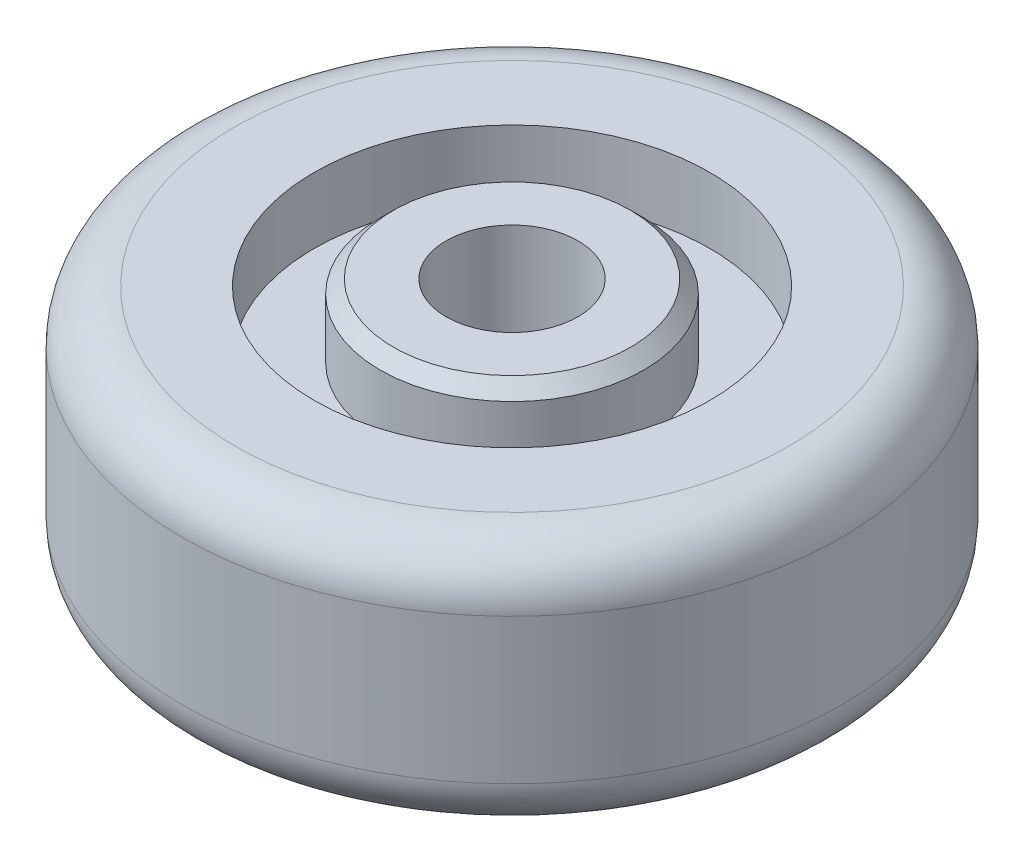
ISO-10303-21;
HEADER;
FILE_DESCRIPTION(('STEP AP214'),'2;1');
FILE_NAME('part.step','',(''),(''),'','','');
FILE_SCHEMA(('AUTOMOTIVE_DESIGN { 1 0 10303 214 1 1 1 1 }'));
ENDSEC;
DATA;
#1=APPLICATION_CONTEXT('core data for automotive mechanical design processes');
#2=APPLICATION_PROTOCOL_DEFINITION('international standard','automotive_design',2000,#1);
#3=PRODUCT_CONTEXT('',#1,'mechanical');
#4=PRODUCT('Part','Part','',(#3));
#5=PRODUCT_RELATED_PRODUCT_CATEGORY('part','',(#4));
#6=PRODUCT_DEFINITION_FORMATION('','',#4);
#7=PRODUCT_DEFINITION_CONTEXT('part definition',#1,'design');
#8=PRODUCT_DEFINITION('design','',#6,#7);
#9=PRODUCT_DEFINITION_SHAPE('','',#8);
#10=(LENGTH_UNIT() NAMED_UNIT(*) SI_UNIT(.MILLI.,.METRE.));
#11=(NAMED_UNIT(*) PLANE_ANGLE_UNIT() SI_UNIT($,.RADIAN.));
#12=(NAMED_UNIT(*) SI_UNIT($,.STERADIAN.) SOLID_ANGLE_UNIT());
#13=UNCERTAINTY_MEASURE_WITH_UNIT(LENGTH_MEASURE(1.E-05),#10,'distance_accuracy_value','');
#14=(GEOMETRIC_REPRESENTATION_CONTEXT(3) GLOBAL_UNCERTAINTY_ASSIGNED_CONTEXT((#13)) GLOBAL_UNIT_ASSIGNED_CONTEXT((#10,
#11,#12)) REPRESENTATION_CONTEXT('',''));
#15=CARTESIAN_POINT('',(0.,0.,0.));
#16=DIRECTION('',(0.,0.,1.));
#17=DIRECTION('',(1.,0.,0.));
#18=AXIS2_PLACEMENT_3D('',#15,#16,#17);
#19=CARTESIAN_POINT('',(0.,10.,-5.));
#20=DIRECTION('',(0.,-1.,0.));
#21=DIRECTION('',(0.,0.,-1.));
#22=AXIS2_PLACEMENT_3D('',#19,#20,#21);
#23=PLANE('',#22);
#24=CARTESIAN_POINT('',(0.,10.,0.));
#25=DIRECTION('',(0.,-1.,0.));
#26=DIRECTION('',(0.,0.,-1.));
#27=AXIS2_PLACEMENT_3D('',#24,#25,#26);
#28=CIRCLE('',#27,9.00000000000001);
#29=CARTESIAN_POINT('',(0.,10.,-9.00000000000001));
#30=VERTEX_POINT('',#29);
#31=EDGE_CURVE('E64',#30,#30,#28,.F.);
#32=ORIENTED_EDGE('',*,*,#31,.T.);
#33=EDGE_LOOP('',(#32));
#34=FACE_BOUND('',#33,.T.);
#35=CARTESIAN_POINT('',(0.,10.,0.));
#36=DIRECTION('',(0.,1.,0.));
#37=DIRECTION('',(0.,0.,1.));
#38=AXIS2_PLACEMENT_3D('',#35,#36,#37);
#39=CIRCLE('',#38,5.);
#40=CARTESIAN_POINT('',(0.,10.,5.));
#41=VERTEX_POINT('',#40);
#42=EDGE_CURVE('E118',#41,#41,#39,.T.);
#43=ORIENTED_EDGE('',*,*,#42,.F.);
#44=EDGE_LOOP('',(#43));
#45=FACE_BOUND('',#44,.T.);
#46=ADVANCED_FACE('F45',(#34,#45),#23,.F.);
#47=CARTESIAN_POINT('',(0.,38.551811756492,0.));
#48=DIRECTION('',(0.,1.,0.));
#49=DIRECTION('',(0.,0.,1.));
#50=AXIS2_PLACEMENT_3D('',#47,#48,#49);
#51=CYLINDRICAL_SURFACE('',#50,10.);
#52=CARTESIAN_POINT('',(0.,8.99999999999999,0.));
#53=DIRECTION('',(0.,-1.,0.));
#54=DIRECTION('',(0.,0.,-1.));
#55=AXIS2_PLACEMENT_3D('',#52,#53,#54);
#56=CIRCLE('',#55,10.);
#57=CARTESIAN_POINT('',(0.,8.99999999999999,-10.));
#58=VERTEX_POINT('',#57);
#59=EDGE_CURVE('E59',#58,#58,#56,.T.);
#60=ORIENTED_EDGE('',*,*,#59,.T.);
#61=EDGE_LOOP('',(#60));
#62=FACE_BOUND('',#61,.T.);
#63=CARTESIAN_POINT('',(0.,4.5,0.));
#64=DIRECTION('',(0.,1.,0.));
#65=DIRECTION('',(0.,0.,1.));
#66=AXIS2_PLACEMENT_3D('',#63,#64,#65);
#67=CIRCLE('',#66,10.);
#68=CARTESIAN_POINT('',(0.,4.5,10.));
#69=VERTEX_POINT('',#68);
#70=EDGE_CURVE('E94',#69,#69,#67,.T.);
#71=ORIENTED_EDGE('',*,*,#70,.T.);
#72=EDGE_LOOP('',(#71));
#73=FACE_BOUND('',#72,.T.);
#74=ADVANCED_FACE('F126',(#62,#73),#51,.T.);
#75=CARTESIAN_POINT('',(0.,4.5,-10.));
#76=DIRECTION('',(0.,-1.,0.));
#77=DIRECTION('',(0.,0.,-1.));
#78=AXIS2_PLACEMENT_3D('',#75,#76,#77);
#79=PLANE('',#78);
#80=ORIENTED_EDGE('',*,*,#70,.F.);
#81=EDGE_LOOP('',(#80));
#82=FACE_BOUND('',#81,.T.);
#83=CARTESIAN_POINT('',(0.,4.5,0.));
#84=DIRECTION('',(0.,1.,0.));
#85=DIRECTION('',(0.,0.,1.));
#86=AXIS2_PLACEMENT_3D('',#83,#84,#85);
#87=CIRCLE('',#86,15.);
#88=CARTESIAN_POINT('',(0.,4.5,15.));
#89=VERTEX_POINT('',#88);
#90=EDGE_CURVE('E98',#89,#89,#87,.T.);
#91=ORIENTED_EDGE('',*,*,#90,.T.);
#92=EDGE_LOOP('',(#91));
#93=FACE_BOUND('',#92,.T.);
#94=ADVANCED_FACE('F133',(#82,#93),#79,.F.);
#95=CARTESIAN_POINT('',(0.,38.551811756492,0.));
#96=DIRECTION('',(0.,1.,0.));
#97=DIRECTION('',(0.,0.,1.));
#98=AXIS2_PLACEMENT_3D('',#95,#96,#97);
#99=CYLINDRICAL_SURFACE('',#98,15.);
#100=ORIENTED_EDGE('',*,*,#90,.F.);
#101=EDGE_LOOP('',(#100));
#102=FACE_BOUND('',#101,.T.);
#103=CARTESIAN_POINT('',(0.,9.5,0.));
#104=DIRECTION('',(0.,1.,0.));
#105=DIRECTION('',(0.,0.,1.));
#106=AXIS2_PLACEMENT_3D('',#103,#104,#105);
#107=CIRCLE('',#106,15.);
#108=CARTESIAN_POINT('',(0.,9.5,15.));
#109=VERTEX_POINT('',#108);
#110=EDGE_CURVE('E102',#109,#109,#107,.T.);
#111=ORIENTED_EDGE('',*,*,#110,.T.);
#112=EDGE_LOOP('',(#111));
#113=FACE_BOUND('',#112,.T.);
#114=ADVANCED_FACE('F167',(#102,#113),#99,.F.);
#115=CARTESIAN_POINT('',(0.,9.5,-15.));
#116=DIRECTION('',(0.,-1.,0.));
#117=DIRECTION('',(0.,0.,-1.));
#118=AXIS2_PLACEMENT_3D('',#115,#116,#117);
#119=PLANE('',#118);
#120=CARTESIAN_POINT('',(0.,9.5,0.));
#121=DIRECTION('',(0.,-1.,0.));
#122=DIRECTION('',(0.,0.,-1.));
#123=AXIS2_PLACEMENT_3D('',#120,#121,#122);
#124=CIRCLE('',#123,21.);
#125=CARTESIAN_POINT('',(0.,9.5,-21.));
#126=VERTEX_POINT('',#125);
#127=EDGE_CURVE('E90',#126,#126,#124,.F.);
#128=ORIENTED_EDGE('',*,*,#127,.T.);
#129=EDGE_LOOP('',(#128));
#130=FACE_BOUND('',#129,.T.);
#131=ORIENTED_EDGE('',*,*,#110,.F.);
#132=EDGE_LOOP('',(#131));
#133=FACE_BOUND('',#132,.T.);
#134=ADVANCED_FACE('F172',(#130,#133),#119,.F.);
#135=CARTESIAN_POINT('',(0.,38.551811756492,0.));
#136=DIRECTION('',(0.,1.,0.));
#137=DIRECTION('',(0.,0.,1.));
#138=AXIS2_PLACEMENT_3D('',#135,#136,#137);
#139=CYLINDRICAL_SURFACE('',#138,25.);
#140=CARTESIAN_POINT('',(0.,5.5,0.));
#141=DIRECTION('',(0.,-1.,0.));
#142=DIRECTION('',(0.,0.,-1.));
#143=AXIS2_PLACEMENT_3D('',#140,#141,#142);
#144=CIRCLE('',#143,25.);
#145=CARTESIAN_POINT('',(0.,5.5,-25.));
#146=VERTEX_POINT('',#145);
#147=EDGE_CURVE('E82',#146,#146,#144,.T.);
#148=ORIENTED_EDGE('',*,*,#147,.T.);
#149=EDGE_LOOP('',(#148));
#150=FACE_BOUND('',#149,.T.);
#151=CARTESIAN_POINT('',(0.,-5.5,0.));
#152=DIRECTION('',(0.,1.,0.));
#153=DIRECTION('',(0.,0.,1.));
#154=AXIS2_PLACEMENT_3D('',#151,#152,#153);
#155=CIRCLE('',#154,25.);
#156=CARTESIAN_POINT('',(0.,-5.5,25.));
#157=VERTEX_POINT('',#156);
#158=EDGE_CURVE('E86',#157,#157,#155,.T.);
#159=ORIENTED_EDGE('',*,*,#158,.T.);
#160=EDGE_LOOP('',(#159));
#161=FACE_BOUND('',#160,.T.);
#162=ADVANCED_FACE('F177',(#150,#161),#139,.T.);
#163=CARTESIAN_POINT('',(0.,-9.5,-25.));
#164=DIRECTION('',(0.,1.,0.));
#165=DIRECTION('',(0.,0.,1.));
#166=AXIS2_PLACEMENT_3D('',#163,#164,#165);
#167=PLANE('',#166);
#168=CARTESIAN_POINT('',(0.,-9.5,0.));
#169=DIRECTION('',(0.,1.,0.));
#170=DIRECTION('',(0.,0.,1.));
#171=AXIS2_PLACEMENT_3D('',#168,#169,#170);
#172=CIRCLE('',#171,21.);
#173=CARTESIAN_POINT('',(0.,-9.5,21.));
#174=VERTEX_POINT('',#173);
#175=EDGE_CURVE('E74',#174,#174,#172,.F.);
#176=ORIENTED_EDGE('',*,*,#175,.T.);
#177=EDGE_LOOP('',(#176));
#178=FACE_BOUND('',#177,.T.);
#179=CARTESIAN_POINT('',(0.,-9.5,0.));
#180=DIRECTION('',(0.,1.,0.));
#181=DIRECTION('',(0.,0.,1.));
#182=AXIS2_PLACEMENT_3D('',#179,#180,#181);
#183=CIRCLE('',#182,19.);
#184=CARTESIAN_POINT('',(0.,-9.5,19.));
#185=VERTEX_POINT('',#184);
#186=EDGE_CURVE('E78',#185,#185,#183,.T.);
#187=ORIENTED_EDGE('',*,*,#186,.T.);
#188=EDGE_LOOP('',(#187));
#189=FACE_BOUND('',#188,.T.);
#190=ADVANCED_FACE('F184',(#178,#189),#167,.F.);
#191=CARTESIAN_POINT('',(0.,38.551811756492,0.));
#192=DIRECTION('',(0.,1.,0.));
#193=DIRECTION('',(0.,0.,1.));
#194=AXIS2_PLACEMENT_3D('',#191,#192,#193);
#195=CYLINDRICAL_SURFACE('',#194,15.);
#196=CARTESIAN_POINT('',(0.,-5.5,0.));
#197=DIRECTION('',(0.,1.,0.));
#198=DIRECTION('',(0.,0.,1.));
#199=AXIS2_PLACEMENT_3D('',#196,#197,#198);
#200=CIRCLE('',#199,15.);
#201=CARTESIAN_POINT('',(0.,-5.5,15.));
#202=VERTEX_POINT('',#201);
#203=EDGE_CURVE('E70',#202,#202,#200,.F.);
#204=ORIENTED_EDGE('',*,*,#203,.T.);
#205=EDGE_LOOP('',(#204));
#206=FACE_BOUND('',#205,.T.);
#207=CARTESIAN_POINT('',(0.,-4.5,0.));
#208=DIRECTION('',(0.,1.,0.));
#209=DIRECTION('',(0.,0.,1.));
#210=AXIS2_PLACEMENT_3D('',#207,#208,#209);
#211=CIRCLE('',#210,15.);
#212=CARTESIAN_POINT('',(0.,-4.5,15.));
#213=VERTEX_POINT('',#212);
#214=EDGE_CURVE('E106',#213,#213,#211,.T.);
#215=ORIENTED_EDGE('',*,*,#214,.T.);
#216=EDGE_LOOP('',(#215));
#217=FACE_BOUND('',#216,.T.);
#218=ADVANCED_FACE('F190',(#206,#217),#195,.F.);
#219=CARTESIAN_POINT('',(0.,-4.5,-15.));
#220=DIRECTION('',(0.,1.,0.));
#221=DIRECTION('',(0.,0.,1.));
#222=AXIS2_PLACEMENT_3D('',#219,#220,#221);
#223=PLANE('',#222);
#224=ORIENTED_EDGE('',*,*,#214,.F.);
#225=EDGE_LOOP('',(#224));
#226=FACE_BOUND('',#225,.T.);
#227=CARTESIAN_POINT('',(0.,-4.5,0.));
#228=DIRECTION('',(0.,1.,0.));
#229=DIRECTION('',(0.,0.,1.));
#230=AXIS2_PLACEMENT_3D('',#227,#228,#229);
#231=CIRCLE('',#230,10.);
#232=CARTESIAN_POINT('',(0.,-4.5,10.));
#233=VERTEX_POINT('',#232);
#234=EDGE_CURVE('E110',#233,#233,#231,.T.);
#235=ORIENTED_EDGE('',*,*,#234,.T.);
#236=EDGE_LOOP('',(#235));
#237=FACE_BOUND('',#236,.T.);
#238=ADVANCED_FACE('F194',(#226,#237),#223,.F.);
#239=CARTESIAN_POINT('',(0.,38.551811756492,0.));
#240=DIRECTION('',(0.,1.,0.));
#241=DIRECTION('',(0.,0.,1.));
#242=AXIS2_PLACEMENT_3D('',#239,#240,#241);
#243=CYLINDRICAL_SURFACE('',#242,10.);
#244=CARTESIAN_POINT('',(0.,-8.99999999999999,0.));
#245=DIRECTION('',(0.,1.,0.));
#246=DIRECTION('',(0.,0.,1.));
#247=AXIS2_PLACEMENT_3D('',#244,#245,#246);
#248=CIRCLE('',#247,10.);
#249=CARTESIAN_POINT('',(0.,-8.99999999999999,10.));
#250=VERTEX_POINT('',#249);
#251=EDGE_CURVE('E54',#250,#250,#248,.T.);
#252=ORIENTED_EDGE('',*,*,#251,.T.);
#253=EDGE_LOOP('',(#252));
#254=FACE_BOUND('',#253,.T.);
#255=ORIENTED_EDGE('',*,*,#234,.F.);
#256=EDGE_LOOP('',(#255));
#257=FACE_BOUND('',#256,.T.);
#258=ADVANCED_FACE('F198',(#254,#257),#243,.T.);
#259=CARTESIAN_POINT('',(0.,-10.,-10.));
#260=DIRECTION('',(0.,1.,0.));
#261=DIRECTION('',(0.,0.,1.));
#262=AXIS2_PLACEMENT_3D('',#259,#260,#261);
#263=PLANE('',#262);
#264=CARTESIAN_POINT('',(0.,-10.,0.));
#265=DIRECTION('',(0.,1.,0.));
#266=DIRECTION('',(0.,0.,1.));
#267=AXIS2_PLACEMENT_3D('',#264,#265,#266);
#268=CIRCLE('',#267,9.);
#269=CARTESIAN_POINT('',(0.,-10.,9.));
#270=VERTEX_POINT('',#269);
#271=EDGE_CURVE('E10',#270,#270,#268,.F.);
#272=ORIENTED_EDGE('',*,*,#271,.T.);
#273=EDGE_LOOP('',(#272));
#274=FACE_BOUND('',#273,.T.);
#275=CARTESIAN_POINT('',(0.,-10.,0.));
#276=DIRECTION('',(0.,1.,0.));
#277=DIRECTION('',(0.,0.,1.));
#278=AXIS2_PLACEMENT_3D('',#275,#276,#277);
#279=CIRCLE('',#278,5.);
#280=CARTESIAN_POINT('',(0.,-10.,5.));
#281=VERTEX_POINT('',#280);
#282=EDGE_CURVE('E114',#281,#281,#279,.T.);
#283=ORIENTED_EDGE('',*,*,#282,.T.);
#284=EDGE_LOOP('',(#283));
#285=FACE_BOUND('',#284,.T.);
#286=ADVANCED_FACE('F202',(#274,#285),#263,.F.);
#287=CARTESIAN_POINT('',(0.,38.551811756492,0.));
#288=DIRECTION('',(0.,1.,0.));
#289=DIRECTION('',(0.,0.,1.));
#290=AXIS2_PLACEMENT_3D('',#287,#288,#289);
#291=CYLINDRICAL_SURFACE('',#290,5.);
#292=ORIENTED_EDGE('',*,*,#282,.F.);
#293=EDGE_LOOP('',(#292));
#294=FACE_BOUND('',#293,.T.);
#295=ORIENTED_EDGE('',*,*,#42,.T.);
#296=EDGE_LOOP('',(#295));
#297=FACE_BOUND('',#296,.T.);
#298=ADVANCED_FACE('F123',(#294,#297),#291,.F.);
#299=CARTESIAN_POINT('',(0.,5.5,0.));
#300=DIRECTION('',(0.,-1.,0.));
#301=DIRECTION('',(0.,0.,-1.));
#302=AXIS2_PLACEMENT_3D('',#299,#300,#301);
#303=TOROIDAL_SURFACE('',#302,21.,4.);
#304=ORIENTED_EDGE('',*,*,#147,.F.);
#305=EDGE_LOOP('',(#304));
#306=FACE_BOUND('',#305,.T.);
#307=ORIENTED_EDGE('',*,*,#127,.F.);
#308=EDGE_LOOP('',(#307));
#309=FACE_BOUND('',#308,.T.);
#310=ADVANCED_FACE('F138',(#306,#309),#303,.T.);
#311=CARTESIAN_POINT('',(0.,-5.5,0.));
#312=DIRECTION('',(0.,1.,0.));
#313=DIRECTION('',(0.,0.,1.));
#314=AXIS2_PLACEMENT_3D('',#311,#312,#313);
#315=TOROIDAL_SURFACE('',#314,21.,4.);
#316=ORIENTED_EDGE('',*,*,#175,.F.);
#317=EDGE_LOOP('',(#316));
#318=FACE_BOUND('',#317,.T.);
#319=ORIENTED_EDGE('',*,*,#158,.F.);
#320=EDGE_LOOP('',(#319));
#321=FACE_BOUND('',#320,.T.);
#322=ADVANCED_FACE('F141',(#318,#321),#315,.T.);
#323=CARTESIAN_POINT('',(0.,-5.5,0.));
#324=DIRECTION('',(0.,1.,0.));
#325=DIRECTION('',(0.,0.,1.));
#326=AXIS2_PLACEMENT_3D('',#323,#324,#325);
#327=TOROIDAL_SURFACE('',#326,19.,4.);
#328=ORIENTED_EDGE('',*,*,#203,.F.);
#329=EDGE_LOOP('',(#328));
#330=FACE_BOUND('',#329,.T.);
#331=ORIENTED_EDGE('',*,*,#186,.F.);
#332=EDGE_LOOP('',(#331));
#333=FACE_BOUND('',#332,.T.);
#334=ADVANCED_FACE('F145',(#330,#333),#327,.T.);
#335=CARTESIAN_POINT('',(0.,10.,0.));
#336=DIRECTION('',(0.,-1.,0.));
#337=DIRECTION('',(0.,0.,-1.));
#338=AXIS2_PLACEMENT_3D('',#335,#336,#337);
#339=CONICAL_SURFACE('',#338,9.00000000000001,0.78539816339744);
#340=ORIENTED_EDGE('',*,*,#59,.F.);
#341=EDGE_LOOP('',(#340));
#342=FACE_BOUND('',#341,.T.);
#343=ORIENTED_EDGE('',*,*,#31,.F.);
#344=EDGE_LOOP('',(#343));
#345=FACE_BOUND('',#344,.T.);
#346=ADVANCED_FACE('F147',(#342,#345),#339,.T.);
#347=CARTESIAN_POINT('',(0.,-8.99999999999999,0.));
#348=DIRECTION('',(0.,1.,0.));
#349=DIRECTION('',(0.,0.,1.));
#350=AXIS2_PLACEMENT_3D('',#347,#348,#349);
#351=CONICAL_SURFACE('',#350,10.,0.785398163397447);
#352=ORIENTED_EDGE('',*,*,#271,.F.);
#353=EDGE_LOOP('',(#352));
#354=FACE_BOUND('',#353,.T.);
#355=ORIENTED_EDGE('',*,*,#251,.F.);
#356=EDGE_LOOP('',(#355));
#357=FACE_BOUND('',#356,.T.);
#358=ADVANCED_FACE('F48',(#354,#357),#351,.T.);
#359=CLOSED_SHELL('',(#46,#74,#94,#114,#134,#162,#190,#218,#238,#258,#286,#298,#310,#322,#334,
#346,#358));
#360=MANIFOLD_SOLID_BREP('B2',#359);
#361=ADVANCED_BREP_SHAPE_REPRESENTATION('',(#18,#360),#14);
#362=SHAPE_DEFINITION_REPRESENTATION(#9,#361);
ENDSEC;
END-ISO-10303-21;
